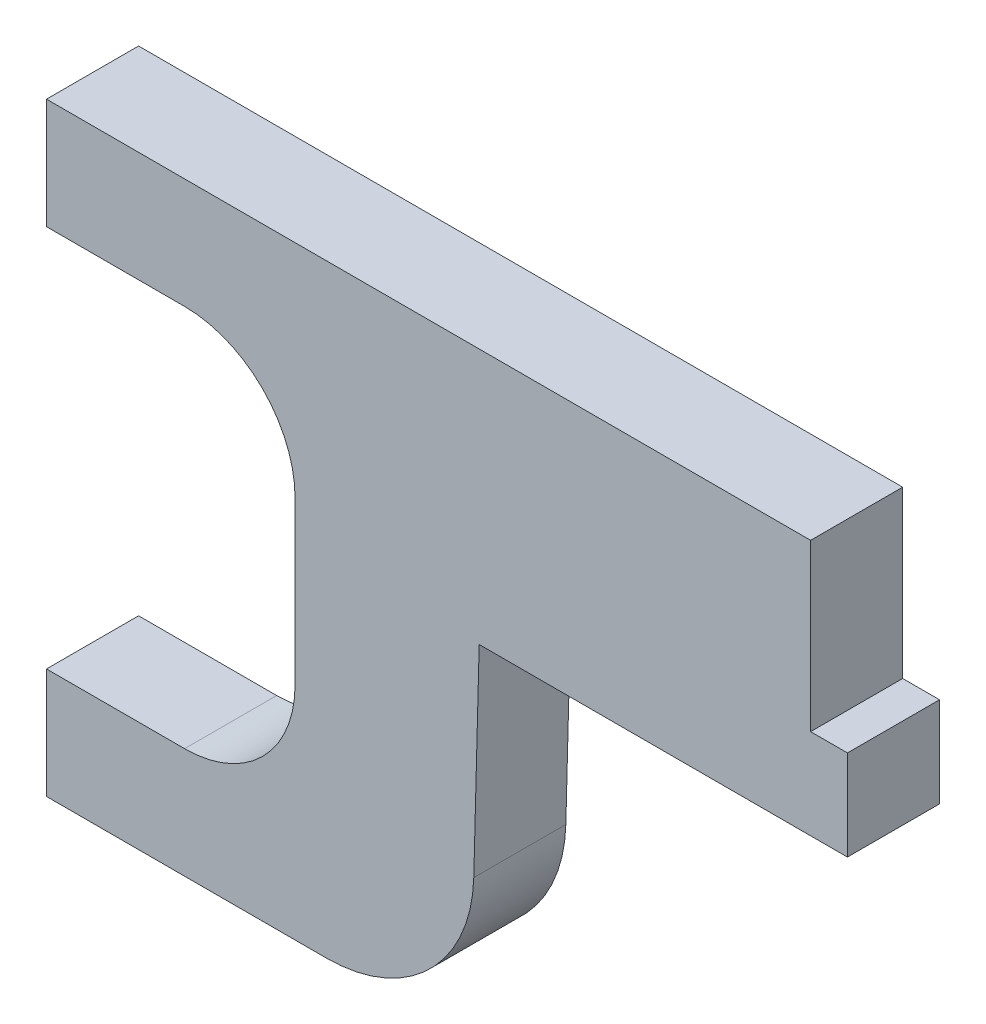
ISO-10303-21;
HEADER;
FILE_DESCRIPTION(('STEP AP214'),'2;1');
FILE_NAME('part.step','',(''),(''),'','','');
FILE_SCHEMA(('AUTOMOTIVE_DESIGN { 1 0 10303 214 1 1 1 1 }'));
ENDSEC;
DATA;
#1=APPLICATION_CONTEXT('core data for automotive mechanical design processes');
#2=APPLICATION_PROTOCOL_DEFINITION('international standard','automotive_design',2000,#1);
#3=PRODUCT_CONTEXT('',#1,'mechanical');
#4=PRODUCT('Part','Part','',(#3));
#5=PRODUCT_RELATED_PRODUCT_CATEGORY('part','',(#4));
#6=PRODUCT_DEFINITION_FORMATION('','',#4);
#7=PRODUCT_DEFINITION_CONTEXT('part definition',#1,'design');
#8=PRODUCT_DEFINITION('design','',#6,#7);
#9=PRODUCT_DEFINITION_SHAPE('','',#8);
#10=(LENGTH_UNIT() NAMED_UNIT(*) SI_UNIT(.MILLI.,.METRE.));
#11=(NAMED_UNIT(*) PLANE_ANGLE_UNIT() SI_UNIT($,.RADIAN.));
#12=(NAMED_UNIT(*) SI_UNIT($,.STERADIAN.) SOLID_ANGLE_UNIT());
#13=UNCERTAINTY_MEASURE_WITH_UNIT(LENGTH_MEASURE(1.E-05),#10,'distance_accuracy_value','');
#14=(GEOMETRIC_REPRESENTATION_CONTEXT(3) GLOBAL_UNCERTAINTY_ASSIGNED_CONTEXT((#13)) GLOBAL_UNIT_ASSIGNED_CONTEXT((#10,
#11,#12)) REPRESENTATION_CONTEXT('',''));
#15=CARTESIAN_POINT('',(0.,0.,0.));
#16=DIRECTION('',(0.,0.,1.));
#17=DIRECTION('',(1.,0.,0.));
#18=AXIS2_PLACEMENT_3D('',#15,#16,#17);
#19=CARTESIAN_POINT('',(1.175,0.945,0.125));
#20=DIRECTION('',(0.,1.,0.));
#21=DIRECTION('',(0.,0.,1.));
#22=AXIS2_PLACEMENT_3D('',#19,#20,#21);
#23=PLANE('',#22);
#24=DIRECTION('',(1.,0.,0.));
#25=VECTOR('',#24,1.);
#26=CARTESIAN_POINT('',(1.175,0.945,-0.125));
#27=LINE('',#26,#25);
#28=CARTESIAN_POINT('',(1.175,0.945,-0.125));
#29=VERTEX_POINT('',#28);
#30=CARTESIAN_POINT('',(2.175,0.945,-0.125));
#31=VERTEX_POINT('',#30);
#32=EDGE_CURVE('E170',#29,#31,#27,.T.);
#33=ORIENTED_EDGE('',*,*,#32,.T.);
#34=DIRECTION('',(0.,0.,-1.));
#35=VECTOR('',#34,1.);
#36=CARTESIAN_POINT('',(2.175,0.945,0.125));
#37=LINE('',#36,#35);
#38=CARTESIAN_POINT('',(2.175,0.945,0.125));
#39=VERTEX_POINT('',#38);
#40=EDGE_CURVE('E149',#39,#31,#37,.T.);
#41=ORIENTED_EDGE('',*,*,#40,.F.);
#42=DIRECTION('',(1.,0.,0.));
#43=VECTOR('',#42,1.);
#44=CARTESIAN_POINT('',(1.175,0.945,0.125));
#45=LINE('',#44,#43);
#46=CARTESIAN_POINT('',(1.175,0.945,0.125));
#47=VERTEX_POINT('',#46);
#48=EDGE_CURVE('E157',#47,#39,#45,.T.);
#49=ORIENTED_EDGE('',*,*,#48,.F.);
#50=DIRECTION('',(0.,0.,-1.));
#51=VECTOR('',#50,1.);
#52=CARTESIAN_POINT('',(1.175,0.945,0.125));
#53=LINE('',#52,#51);
#54=EDGE_CURVE('E219',#47,#29,#53,.T.);
#55=ORIENTED_EDGE('',*,*,#54,.T.);
#56=EDGE_LOOP('',(#33,#41,#49,#55));
#57=FACE_BOUND('',#56,.T.);
#58=ADVANCED_FACE('F37',(#57),#23,.F.);
#59=CARTESIAN_POINT('',(2.175,0.945,0.125));
#60=DIRECTION('',(-1.,0.,0.));
#61=DIRECTION('',(0.,0.,1.));
#62=AXIS2_PLACEMENT_3D('',#59,#60,#61);
#63=PLANE('',#62);
#64=DIRECTION('',(0.,1.,0.));
#65=VECTOR('',#64,1.);
#66=CARTESIAN_POINT('',(2.175,0.945,-0.125));
#67=LINE('',#66,#65);
#68=CARTESIAN_POINT('',(2.175,1.19,-0.125));
#69=VERTEX_POINT('',#68);
#70=EDGE_CURVE('E334',#31,#69,#67,.T.);
#71=ORIENTED_EDGE('',*,*,#70,.T.);
#72=DIRECTION('',(0.,0.,-1.));
#73=VECTOR('',#72,1.);
#74=CARTESIAN_POINT('',(2.175,1.19,0.125));
#75=LINE('',#74,#73);
#76=CARTESIAN_POINT('',(2.175,1.19,0.125));
#77=VERTEX_POINT('',#76);
#78=EDGE_CURVE('E152',#77,#69,#75,.T.);
#79=ORIENTED_EDGE('',*,*,#78,.F.);
#80=DIRECTION('',(0.,1.,0.));
#81=VECTOR('',#80,1.);
#82=CARTESIAN_POINT('',(2.175,0.945,0.125));
#83=LINE('',#82,#81);
#84=EDGE_CURVE('E145',#39,#77,#83,.T.);
#85=ORIENTED_EDGE('',*,*,#84,.F.);
#86=ORIENTED_EDGE('',*,*,#40,.T.);
#87=EDGE_LOOP('',(#71,#79,#85,#86));
#88=FACE_BOUND('',#87,.T.);
#89=ADVANCED_FACE('F147',(#88),#63,.F.);
#90=CARTESIAN_POINT('',(2.075,1.19,0.125));
#91=DIRECTION('',(0.,-1.,0.));
#92=DIRECTION('',(0.,0.,-1.));
#93=AXIS2_PLACEMENT_3D('',#90,#91,#92);
#94=PLANE('',#93);
#95=DIRECTION('',(-1.,0.,0.));
#96=VECTOR('',#95,1.);
#97=CARTESIAN_POINT('',(2.075,1.19,-0.125));
#98=LINE('',#97,#96);
#99=CARTESIAN_POINT('',(2.075,1.19,-0.125));
#100=VERTEX_POINT('',#99);
#101=EDGE_CURVE('E325',#69,#100,#98,.T.);
#102=ORIENTED_EDGE('',*,*,#101,.T.);
#103=DIRECTION('',(0.,0.,-1.));
#104=VECTOR('',#103,1.);
#105=CARTESIAN_POINT('',(2.075,1.19,0.125));
#106=LINE('',#105,#104);
#107=CARTESIAN_POINT('',(2.075,1.19,0.125));
#108=VERTEX_POINT('',#107);
#109=EDGE_CURVE('E181',#108,#100,#106,.T.);
#110=ORIENTED_EDGE('',*,*,#109,.F.);
#111=DIRECTION('',(-1.,0.,0.));
#112=VECTOR('',#111,1.);
#113=CARTESIAN_POINT('',(2.075,1.19,0.125));
#114=LINE('',#113,#112);
#115=EDGE_CURVE('E156',#77,#108,#114,.T.);
#116=ORIENTED_EDGE('',*,*,#115,.F.);
#117=ORIENTED_EDGE('',*,*,#78,.T.);
#118=EDGE_LOOP('',(#102,#110,#116,#117));
#119=FACE_BOUND('',#118,.T.);
#120=ADVANCED_FACE('F352',(#119),#94,.F.);
#121=CARTESIAN_POINT('',(2.075,1.64,0.125));
#122=DIRECTION('',(-1.,0.,0.));
#123=DIRECTION('',(0.,0.,1.));
#124=AXIS2_PLACEMENT_3D('',#121,#122,#123);
#125=PLANE('',#124);
#126=DIRECTION('',(0.,1.,0.));
#127=VECTOR('',#126,1.);
#128=CARTESIAN_POINT('',(2.075,1.64,-0.125));
#129=LINE('',#128,#127);
#130=CARTESIAN_POINT('',(2.075,1.64,-0.125));
#131=VERTEX_POINT('',#130);
#132=EDGE_CURVE('E313',#100,#131,#129,.T.);
#133=ORIENTED_EDGE('',*,*,#132,.T.);
#134=DIRECTION('',(0.,0.,-1.));
#135=VECTOR('',#134,1.);
#136=CARTESIAN_POINT('',(2.075,1.64,0.125));
#137=LINE('',#136,#135);
#138=CARTESIAN_POINT('',(2.075,1.64,0.125));
#139=VERTEX_POINT('',#138);
#140=EDGE_CURVE('E309',#139,#131,#137,.T.);
#141=ORIENTED_EDGE('',*,*,#140,.F.);
#142=DIRECTION('',(0.,1.,0.));
#143=VECTOR('',#142,1.);
#144=CARTESIAN_POINT('',(2.075,1.64,0.125));
#145=LINE('',#144,#143);
#146=EDGE_CURVE('E304',#108,#139,#145,.T.);
#147=ORIENTED_EDGE('',*,*,#146,.F.);
#148=ORIENTED_EDGE('',*,*,#109,.T.);
#149=EDGE_LOOP('',(#133,#141,#147,#148));
#150=FACE_BOUND('',#149,.T.);
#151=ADVANCED_FACE('F359',(#150),#125,.F.);
#152=CARTESIAN_POINT('',(0.7,1.64,0.125));
#153=DIRECTION('',(0.,-1.,0.));
#154=DIRECTION('',(1.,0.,0.));
#155=AXIS2_PLACEMENT_3D('',#152,#153,#154);
#156=PLANE('',#155);
#157=DIRECTION('',(-1.,0.,0.));
#158=VECTOR('',#157,1.);
#159=CARTESIAN_POINT('',(0.7,1.64,-0.125));
#160=LINE('',#159,#158);
#161=CARTESIAN_POINT('',(0.,1.64,-0.125));
#162=VERTEX_POINT('',#161);
#163=EDGE_CURVE('E300',#131,#162,#160,.T.);
#164=ORIENTED_EDGE('',*,*,#163,.T.);
#165=DIRECTION('',(0.,0.,-1.));
#166=VECTOR('',#165,1.);
#167=CARTESIAN_POINT('',(0.,1.64,0.125));
#168=LINE('',#167,#166);
#169=CARTESIAN_POINT('',(0.,1.64,0.125));
#170=VERTEX_POINT('',#169);
#171=EDGE_CURVE('E296',#170,#162,#168,.T.);
#172=ORIENTED_EDGE('',*,*,#171,.F.);
#173=DIRECTION('',(-1.,0.,0.));
#174=VECTOR('',#173,1.);
#175=CARTESIAN_POINT('',(2.075,1.64,0.125));
#176=LINE('',#175,#174);
#177=EDGE_CURVE('E291',#139,#170,#176,.T.);
#178=ORIENTED_EDGE('',*,*,#177,.F.);
#179=ORIENTED_EDGE('',*,*,#140,.T.);
#180=EDGE_LOOP('',(#164,#172,#178,#179));
#181=FACE_BOUND('',#180,.T.);
#182=ADVANCED_FACE('F361',(#181),#156,.F.);
#183=CARTESIAN_POINT('',(0.,1.64,0.125));
#184=DIRECTION('',(1.,0.,0.));
#185=DIRECTION('',(0.,1.,0.));
#186=AXIS2_PLACEMENT_3D('',#183,#184,#185);
#187=PLANE('',#186);
#188=DIRECTION('',(0.,-1.,0.));
#189=VECTOR('',#188,1.);
#190=CARTESIAN_POINT('',(0.,1.64,-0.125));
#191=LINE('',#190,#189);
#192=CARTESIAN_POINT('',(0.,1.34,-0.125));
#193=VERTEX_POINT('',#192);
#194=EDGE_CURVE('E287',#162,#193,#191,.T.);
#195=ORIENTED_EDGE('',*,*,#194,.T.);
#196=DIRECTION('',(0.,0.,-1.));
#197=VECTOR('',#196,1.);
#198=CARTESIAN_POINT('',(0.,1.34,0.125));
#199=LINE('',#198,#197);
#200=CARTESIAN_POINT('',(0.,1.34,0.125));
#201=VERTEX_POINT('',#200);
#202=EDGE_CURVE('E277',#201,#193,#199,.T.);
#203=ORIENTED_EDGE('',*,*,#202,.F.);
#204=DIRECTION('',(0.,-1.,0.));
#205=VECTOR('',#204,1.);
#206=CARTESIAN_POINT('',(0.,1.64,0.125));
#207=LINE('',#206,#205);
#208=EDGE_CURVE('E282',#170,#201,#207,.T.);
#209=ORIENTED_EDGE('',*,*,#208,.F.);
#210=ORIENTED_EDGE('',*,*,#171,.T.);
#211=EDGE_LOOP('',(#195,#203,#209,#210));
#212=FACE_BOUND('',#211,.T.);
#213=ADVANCED_FACE('F366',(#212),#187,.F.);
#214=CARTESIAN_POINT('',(0.,1.34,0.125));
#215=DIRECTION('',(0.,1.,0.));
#216=DIRECTION('',(0.,0.,1.));
#217=AXIS2_PLACEMENT_3D('',#214,#215,#216);
#218=PLANE('',#217);
#219=DIRECTION('',(1.,0.,0.));
#220=VECTOR('',#219,1.);
#221=CARTESIAN_POINT('',(0.,1.34,-0.125));
#222=LINE('',#221,#220);
#223=CARTESIAN_POINT('',(0.375,1.34,-0.125));
#224=VERTEX_POINT('',#223);
#225=EDGE_CURVE('E246',#193,#224,#222,.T.);
#226=ORIENTED_EDGE('',*,*,#225,.T.);
#227=DIRECTION('',(0.,0.,-1.));
#228=VECTOR('',#227,1.);
#229=CARTESIAN_POINT('',(0.375,1.34,0.125));
#230=LINE('',#229,#228);
#231=CARTESIAN_POINT('',(0.375,1.34,0.125));
#232=VERTEX_POINT('',#231);
#233=EDGE_CURVE('E191',#224,#232,#230,.F.);
#234=ORIENTED_EDGE('',*,*,#233,.T.);
#235=DIRECTION('',(1.,0.,0.));
#236=VECTOR('',#235,1.);
#237=CARTESIAN_POINT('',(0.,1.34,0.125));
#238=LINE('',#237,#236);
#239=EDGE_CURVE('E239',#201,#232,#238,.T.);
#240=ORIENTED_EDGE('',*,*,#239,.F.);
#241=ORIENTED_EDGE('',*,*,#202,.T.);
#242=EDGE_LOOP('',(#226,#234,#240,#241));
#243=FACE_BOUND('',#242,.T.);
#244=ADVANCED_FACE('F484',(#243),#218,.F.);
#245=CARTESIAN_POINT('',(0.675,1.34,0.125));
#246=DIRECTION('',(1.,0.,0.));
#247=DIRECTION('',(0.,0.,-1.));
#248=AXIS2_PLACEMENT_3D('',#245,#246,#247);
#249=PLANE('',#248);
#250=DIRECTION('',(0.,-1.,0.));
#251=VECTOR('',#250,1.);
#252=CARTESIAN_POINT('',(0.675,1.34,-0.125));
#253=LINE('',#252,#251);
#254=CARTESIAN_POINT('',(0.675,1.04,-0.125));
#255=VERTEX_POINT('',#254);
#256=CARTESIAN_POINT('',(0.675,0.6,-0.125));
#257=VERTEX_POINT('',#256);
#258=EDGE_CURVE('E241',#255,#257,#253,.T.);
#259=ORIENTED_EDGE('',*,*,#258,.T.);
#260=DIRECTION('',(0.,0.,-1.));
#261=VECTOR('',#260,1.);
#262=CARTESIAN_POINT('',(0.675,0.6,0.125));
#263=LINE('',#262,#261);
#264=CARTESIAN_POINT('',(0.675,0.6,0.125));
#265=VERTEX_POINT('',#264);
#266=EDGE_CURVE('E188',#257,#265,#263,.F.);
#267=ORIENTED_EDGE('',*,*,#266,.T.);
#268=DIRECTION('',(0.,-1.,0.));
#269=VECTOR('',#268,1.);
#270=CARTESIAN_POINT('',(0.675,1.34,0.125));
#271=LINE('',#270,#269);
#272=CARTESIAN_POINT('',(0.675,1.04,0.125));
#273=VERTEX_POINT('',#272);
#274=EDGE_CURVE('E234',#273,#265,#271,.T.);
#275=ORIENTED_EDGE('',*,*,#274,.F.);
#276=DIRECTION('',(0.,0.,-1.));
#277=VECTOR('',#276,1.);
#278=CARTESIAN_POINT('',(0.675,1.04,-0.125));
#279=LINE('',#278,#277);
#280=EDGE_CURVE('E178',#273,#255,#279,.T.);
#281=ORIENTED_EDGE('',*,*,#280,.T.);
#282=EDGE_LOOP('',(#259,#267,#275,#281));
#283=FACE_BOUND('',#282,.T.);
#284=ADVANCED_FACE('F377',(#283),#249,.F.);
#285=CARTESIAN_POINT('',(0.675,0.3,0.125));
#286=DIRECTION('',(0.,-1.,0.));
#287=DIRECTION('',(1.,0.,0.));
#288=AXIS2_PLACEMENT_3D('',#285,#286,#287);
#289=PLANE('',#288);
#290=DIRECTION('',(-1.,0.,0.));
#291=VECTOR('',#290,1.);
#292=CARTESIAN_POINT('',(0.675,0.3,0.125));
#293=LINE('',#292,#291);
#294=CARTESIAN_POINT('',(0.375,0.3,0.125));
#295=VERTEX_POINT('',#294);
#296=CARTESIAN_POINT('',(0.,0.3,0.125));
#297=VERTEX_POINT('',#296);
#298=EDGE_CURVE('E238',#295,#297,#293,.T.);
#299=ORIENTED_EDGE('',*,*,#298,.F.);
#300=DIRECTION('',(0.,0.,-1.));
#301=VECTOR('',#300,1.);
#302=CARTESIAN_POINT('',(0.375,0.3,-0.125));
#303=LINE('',#302,#301);
#304=CARTESIAN_POINT('',(0.375,0.3,-0.125));
#305=VERTEX_POINT('',#304);
#306=EDGE_CURVE('E172',#295,#305,#303,.T.);
#307=ORIENTED_EDGE('',*,*,#306,.T.);
#308=DIRECTION('',(-1.,0.,0.));
#309=VECTOR('',#308,1.);
#310=CARTESIAN_POINT('',(0.675,0.3,-0.125));
#311=LINE('',#310,#309);
#312=CARTESIAN_POINT('',(0.,0.3,-0.125));
#313=VERTEX_POINT('',#312);
#314=EDGE_CURVE('E245',#305,#313,#311,.T.);
#315=ORIENTED_EDGE('',*,*,#314,.T.);
#316=DIRECTION('',(0.,0.,-1.));
#317=VECTOR('',#316,1.);
#318=CARTESIAN_POINT('',(0.,0.3,0.125));
#319=LINE('',#318,#317);
#320=EDGE_CURVE('E269',#297,#313,#319,.T.);
#321=ORIENTED_EDGE('',*,*,#320,.F.);
#322=EDGE_LOOP('',(#299,#307,#315,#321));
#323=FACE_BOUND('',#322,.T.);
#324=ADVANCED_FACE('F388',(#323),#289,.F.);
#325=CARTESIAN_POINT('',(0.,0.3,0.125));
#326=DIRECTION('',(1.,0.,0.));
#327=DIRECTION('',(0.,1.,0.));
#328=AXIS2_PLACEMENT_3D('',#325,#326,#327);
#329=PLANE('',#328);
#330=DIRECTION('',(0.,-1.,0.));
#331=VECTOR('',#330,1.);
#332=CARTESIAN_POINT('',(0.,0.3,-0.125));
#333=LINE('',#332,#331);
#334=CARTESIAN_POINT('',(0.,0.,-0.125));
#335=VERTEX_POINT('',#334);
#336=EDGE_CURVE('E254',#313,#335,#333,.T.);
#337=ORIENTED_EDGE('',*,*,#336,.T.);
#338=DIRECTION('',(0.,0.,-1.));
#339=VECTOR('',#338,1.);
#340=CARTESIAN_POINT('',(0.,0.,0.125));
#341=LINE('',#340,#339);
#342=CARTESIAN_POINT('',(0.,0.,0.125));
#343=VERTEX_POINT('',#342);
#344=EDGE_CURVE('E265',#343,#335,#341,.T.);
#345=ORIENTED_EDGE('',*,*,#344,.F.);
#346=DIRECTION('',(0.,-1.,0.));
#347=VECTOR('',#346,1.);
#348=CARTESIAN_POINT('',(0.,0.3,0.125));
#349=LINE('',#348,#347);
#350=EDGE_CURVE('E250',#297,#343,#349,.T.);
#351=ORIENTED_EDGE('',*,*,#350,.F.);
#352=ORIENTED_EDGE('',*,*,#320,.T.);
#353=EDGE_LOOP('',(#337,#345,#351,#352));
#354=FACE_BOUND('',#353,.T.);
#355=ADVANCED_FACE('F394',(#354),#329,.F.);
#356=CARTESIAN_POINT('',(0.,0.,0.125));
#357=DIRECTION('',(0.,1.,0.));
#358=DIRECTION('',(0.,0.,1.));
#359=AXIS2_PLACEMENT_3D('',#356,#357,#358);
#360=PLANE('',#359);
#361=DIRECTION('',(1.,0.,0.));
#362=VECTOR('',#361,1.);
#363=CARTESIAN_POINT('',(0.,0.,-0.125));
#364=LINE('',#363,#362);
#365=CARTESIAN_POINT('',(0.760442061379287,0.,-0.125));
#366=VERTEX_POINT('',#365);
#367=EDGE_CURVE('E223',#335,#366,#364,.T.);
#368=ORIENTED_EDGE('',*,*,#367,.T.);
#369=DIRECTION('',(0.,0.,-1.));
#370=VECTOR('',#369,1.);
#371=CARTESIAN_POINT('',(0.760442061379287,0.,0.125));
#372=LINE('',#371,#370);
#373=CARTESIAN_POINT('',(0.760442061379287,0.,0.125));
#374=VERTEX_POINT('',#373);
#375=EDGE_CURVE('E46',#366,#374,#372,.F.);
#376=ORIENTED_EDGE('',*,*,#375,.T.);
#377=DIRECTION('',(1.,0.,0.));
#378=VECTOR('',#377,1.);
#379=CARTESIAN_POINT('',(0.,0.,0.125));
#380=LINE('',#379,#378);
#381=EDGE_CURVE('E220',#343,#374,#380,.T.);
#382=ORIENTED_EDGE('',*,*,#381,.F.);
#383=ORIENTED_EDGE('',*,*,#344,.T.);
#384=EDGE_LOOP('',(#368,#376,#382,#383));
#385=FACE_BOUND('',#384,.T.);
#386=ADVANCED_FACE('F395',(#385),#360,.F.);
#387=CARTESIAN_POINT('',(1.15,0.,0.125));
#388=DIRECTION('',(-0.9996502493615,0.0264457737926321,0.));
#389=DIRECTION('',(-0.0264457737926321,-0.9996502493615,0.));
#390=AXIS2_PLACEMENT_3D('',#387,#388,#389);
#391=PLANE('',#390);
#392=DIRECTION('',(0.0264457737926321,0.9996502493615,0.));
#393=VECTOR('',#392,1.);
#394=CARTESIAN_POINT('',(1.15,0.,0.125));
#395=LINE('',#394,#393);
#396=CARTESIAN_POINT('',(1.16030216112389,0.389421690482947,0.125));
#397=VERTEX_POINT('',#396);
#398=EDGE_CURVE('E162',#397,#47,#395,.T.);
#399=ORIENTED_EDGE('',*,*,#398,.F.);
#400=DIRECTION('',(0.,0.,-1.));
#401=VECTOR('',#400,1.);
#402=CARTESIAN_POINT('',(1.16030216112389,0.389421690482947,0.125));
#403=LINE('',#402,#401);
#404=CARTESIAN_POINT('',(1.16030216112389,0.389421690482947,-0.125));
#405=VERTEX_POINT('',#404);
#406=EDGE_CURVE('E206',#397,#405,#403,.T.);
#407=ORIENTED_EDGE('',*,*,#406,.T.);
#408=DIRECTION('',(0.0264457737926321,0.9996502493615,0.));
#409=VECTOR('',#408,1.);
#410=CARTESIAN_POINT('',(1.15,0.,-0.125));
#411=LINE('',#410,#409);
#412=EDGE_CURVE('E167',#405,#29,#411,.T.);
#413=ORIENTED_EDGE('',*,*,#412,.T.);
#414=ORIENTED_EDGE('',*,*,#54,.F.);
#415=EDGE_LOOP('',(#399,#407,#413,#414));
#416=FACE_BOUND('',#415,.T.);
#417=ADVANCED_FACE('F397',(#416),#391,.F.);
#418=CARTESIAN_POINT('',(0.,0.,0.125));
#419=DIRECTION('',(0.,0.,1.));
#420=DIRECTION('',(1.,0.,0.));
#421=AXIS2_PLACEMENT_3D('',#418,#419,#420);
#422=PLANE('',#421);
#423=ORIENTED_EDGE('',*,*,#381,.T.);
#424=CARTESIAN_POINT('',(0.760442061379287,0.4,0.125));
#425=DIRECTION('',(0.,0.,1.));
#426=DIRECTION('',(1.,0.,0.));
#427=AXIS2_PLACEMENT_3D('',#424,#425,#426);
#428=CIRCLE('',#427,0.4);
#429=EDGE_CURVE('E11',#374,#397,#428,.T.);
#430=ORIENTED_EDGE('',*,*,#429,.T.);
#431=ORIENTED_EDGE('',*,*,#398,.T.);
#432=ORIENTED_EDGE('',*,*,#48,.T.);
#433=ORIENTED_EDGE('',*,*,#84,.T.);
#434=ORIENTED_EDGE('',*,*,#115,.T.);
#435=ORIENTED_EDGE('',*,*,#146,.T.);
#436=ORIENTED_EDGE('',*,*,#177,.T.);
#437=ORIENTED_EDGE('',*,*,#208,.T.);
#438=ORIENTED_EDGE('',*,*,#239,.T.);
#439=CARTESIAN_POINT('',(0.375,1.04,0.125));
#440=DIRECTION('',(0.,0.,1.));
#441=DIRECTION('',(1.,0.,0.));
#442=AXIS2_PLACEMENT_3D('',#439,#440,#441);
#443=CIRCLE('',#442,0.3);
#444=EDGE_CURVE('E203',#232,#273,#443,.F.);
#445=ORIENTED_EDGE('',*,*,#444,.T.);
#446=ORIENTED_EDGE('',*,*,#274,.T.);
#447=CARTESIAN_POINT('',(0.375,0.6,0.125));
#448=DIRECTION('',(0.,0.,1.));
#449=DIRECTION('',(1.,0.,0.));
#450=AXIS2_PLACEMENT_3D('',#447,#448,#449);
#451=CIRCLE('',#450,0.3);
#452=EDGE_CURVE('E197',#265,#295,#451,.F.);
#453=ORIENTED_EDGE('',*,*,#452,.T.);
#454=ORIENTED_EDGE('',*,*,#298,.T.);
#455=ORIENTED_EDGE('',*,*,#350,.T.);
#456=EDGE_LOOP('',(#423,#430,#431,#432,#433,#434,#435,#436,#437,#438,#445,#446,#453,#454,#455));
#457=FACE_BOUND('',#456,.T.);
#458=ADVANCED_FACE('F160',(#457),#422,.T.);
#459=CARTESIAN_POINT('',(0.,0.,-0.125));
#460=DIRECTION('',(0.,0.,1.));
#461=DIRECTION('',(1.,0.,0.));
#462=AXIS2_PLACEMENT_3D('',#459,#460,#461);
#463=PLANE('',#462);
#464=ORIENTED_EDGE('',*,*,#412,.F.);
#465=CARTESIAN_POINT('',(0.760442061379287,0.4,-0.125));
#466=DIRECTION('',(0.,0.,1.));
#467=DIRECTION('',(1.,0.,0.));
#468=AXIS2_PLACEMENT_3D('',#465,#466,#467);
#469=CIRCLE('',#468,0.4);
#470=EDGE_CURVE('E60',#405,#366,#469,.F.);
#471=ORIENTED_EDGE('',*,*,#470,.T.);
#472=ORIENTED_EDGE('',*,*,#367,.F.);
#473=ORIENTED_EDGE('',*,*,#336,.F.);
#474=ORIENTED_EDGE('',*,*,#314,.F.);
#475=CARTESIAN_POINT('',(0.375,0.6,-0.125));
#476=DIRECTION('',(0.,0.,1.));
#477=DIRECTION('',(1.,0.,0.));
#478=AXIS2_PLACEMENT_3D('',#475,#476,#477);
#479=CIRCLE('',#478,0.3);
#480=EDGE_CURVE('E194',#305,#257,#479,.T.);
#481=ORIENTED_EDGE('',*,*,#480,.T.);
#482=ORIENTED_EDGE('',*,*,#258,.F.);
#483=CARTESIAN_POINT('',(0.375,1.04,-0.125));
#484=DIRECTION('',(0.,0.,1.));
#485=DIRECTION('',(1.,0.,0.));
#486=AXIS2_PLACEMENT_3D('',#483,#484,#485);
#487=CIRCLE('',#486,0.3);
#488=EDGE_CURVE('E200',#255,#224,#487,.T.);
#489=ORIENTED_EDGE('',*,*,#488,.T.);
#490=ORIENTED_EDGE('',*,*,#225,.F.);
#491=ORIENTED_EDGE('',*,*,#194,.F.);
#492=ORIENTED_EDGE('',*,*,#163,.F.);
#493=ORIENTED_EDGE('',*,*,#132,.F.);
#494=ORIENTED_EDGE('',*,*,#101,.F.);
#495=ORIENTED_EDGE('',*,*,#70,.F.);
#496=ORIENTED_EDGE('',*,*,#32,.F.);
#497=EDGE_LOOP('',(#464,#471,#472,#473,#474,#481,#482,#489,#490,#491,#492,#493,#494,#495,#496));
#498=FACE_BOUND('',#497,.T.);
#499=ADVANCED_FACE('F348',(#498),#463,.F.);
#500=CARTESIAN_POINT('',(0.375,0.6,0.125));
#501=DIRECTION('',(0.,0.,1.));
#502=DIRECTION('',(1.,0.,0.));
#503=AXIS2_PLACEMENT_3D('',#500,#501,#502);
#504=CYLINDRICAL_SURFACE('',#503,0.3);
#505=ORIENTED_EDGE('',*,*,#452,.F.);
#506=ORIENTED_EDGE('',*,*,#266,.F.);
#507=ORIENTED_EDGE('',*,*,#480,.F.);
#508=ORIENTED_EDGE('',*,*,#306,.F.);
#509=EDGE_LOOP('',(#505,#506,#507,#508));
#510=FACE_BOUND('',#509,.T.);
#511=ADVANCED_FACE('F385',(#510),#504,.F.);
#512=CARTESIAN_POINT('',(0.375,1.04,0.125));
#513=DIRECTION('',(0.,0.,1.));
#514=DIRECTION('',(1.,0.,0.));
#515=AXIS2_PLACEMENT_3D('',#512,#513,#514);
#516=CYLINDRICAL_SURFACE('',#515,0.3);
#517=ORIENTED_EDGE('',*,*,#444,.F.);
#518=ORIENTED_EDGE('',*,*,#233,.F.);
#519=ORIENTED_EDGE('',*,*,#488,.F.);
#520=ORIENTED_EDGE('',*,*,#280,.F.);
#521=EDGE_LOOP('',(#517,#518,#519,#520));
#522=FACE_BOUND('',#521,.T.);
#523=ADVANCED_FACE('F374',(#522),#516,.F.);
#524=CARTESIAN_POINT('',(0.760442061379287,0.4,0.125));
#525=DIRECTION('',(0.,0.,-1.));
#526=DIRECTION('',(-1.,0.,0.));
#527=AXIS2_PLACEMENT_3D('',#524,#525,#526);
#528=CYLINDRICAL_SURFACE('',#527,0.4);
#529=ORIENTED_EDGE('',*,*,#429,.F.);
#530=ORIENTED_EDGE('',*,*,#375,.F.);
#531=ORIENTED_EDGE('',*,*,#470,.F.);
#532=ORIENTED_EDGE('',*,*,#406,.F.);
#533=EDGE_LOOP('',(#529,#530,#531,#532));
#534=FACE_BOUND('',#533,.T.);
#535=ADVANCED_FACE('F39',(#534),#528,.T.);
#536=CLOSED_SHELL('',(#58,#89,#120,#151,#182,#213,#244,#284,#324,#355,#386,#417,#458,#499,#511,
#523,#535));
#537=MANIFOLD_SOLID_BREP('B2',#536);
#538=ADVANCED_BREP_SHAPE_REPRESENTATION('',(#18,#537),#14);
#539=SHAPE_DEFINITION_REPRESENTATION(#9,#538);
ENDSEC;
END-ISO-10303-21;
